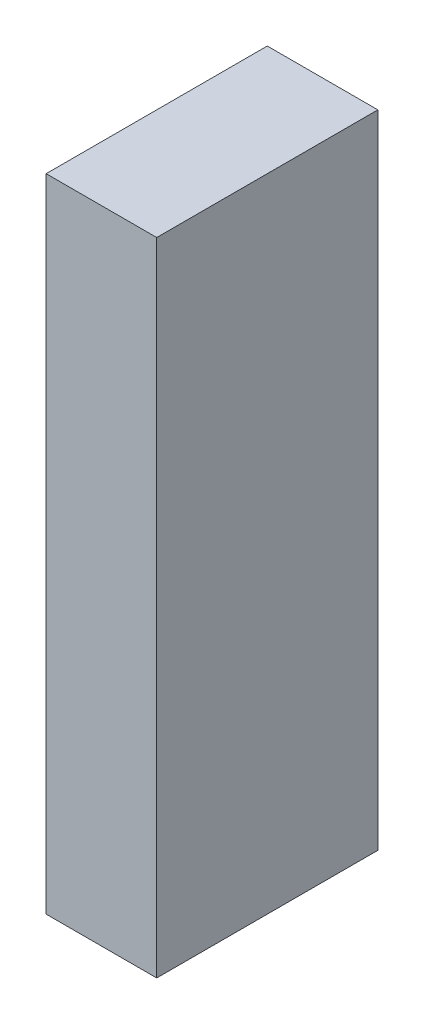
ISO-10303-21;
HEADER;
FILE_DESCRIPTION(('STEP AP214'),'2;1');
FILE_NAME('part.step','',(''),(''),'','','');
FILE_SCHEMA(('AUTOMOTIVE_DESIGN { 1 0 10303 214 1 1 1 1 }'));
ENDSEC;
DATA;
#1=APPLICATION_CONTEXT('core data for automotive mechanical design processes');
#2=APPLICATION_PROTOCOL_DEFINITION('international standard','automotive_design',2000,#1);
#3=PRODUCT_CONTEXT('',#1,'mechanical');
#4=PRODUCT('Part','Part','',(#3));
#5=PRODUCT_RELATED_PRODUCT_CATEGORY('part','',(#4));
#6=PRODUCT_DEFINITION_FORMATION('','',#4);
#7=PRODUCT_DEFINITION_CONTEXT('part definition',#1,'design');
#8=PRODUCT_DEFINITION('design','',#6,#7);
#9=PRODUCT_DEFINITION_SHAPE('','',#8);
#10=(LENGTH_UNIT() NAMED_UNIT(*) SI_UNIT(.MILLI.,.METRE.));
#11=(NAMED_UNIT(*) PLANE_ANGLE_UNIT() SI_UNIT($,.RADIAN.));
#12=(NAMED_UNIT(*) SI_UNIT($,.STERADIAN.) SOLID_ANGLE_UNIT());
#13=UNCERTAINTY_MEASURE_WITH_UNIT(LENGTH_MEASURE(1.E-05),#10,'distance_accuracy_value','');
#14=(GEOMETRIC_REPRESENTATION_CONTEXT(3) GLOBAL_UNCERTAINTY_ASSIGNED_CONTEXT((#13)) GLOBAL_UNIT_ASSIGNED_CONTEXT((#10,
#11,#12)) REPRESENTATION_CONTEXT('',''));
#15=CARTESIAN_POINT('',(0.,0.,0.));
#16=DIRECTION('',(0.,0.,1.));
#17=DIRECTION('',(1.,0.,0.));
#18=AXIS2_PLACEMENT_3D('',#15,#16,#17);
#19=CARTESIAN_POINT('',(12.7000000000001,709.611738,-12.7));
#20=DIRECTION('',(-1.,0.,0.));
#21=DIRECTION('',(0.,-1.,0.));
#22=AXIS2_PLACEMENT_3D('',#19,#20,#21);
#23=PLANE('',#22);
#24=DIRECTION('',(0.,-1.,0.));
#25=VECTOR('',#24,1.);
#26=CARTESIAN_POINT('',(12.7000000000001,709.611738,0.));
#27=LINE('',#26,#25);
#28=CARTESIAN_POINT('',(12.7000000000001,709.611738,0.));
#29=VERTEX_POINT('',#28);
#30=CARTESIAN_POINT('',(12.7000000000001,672.781738,0.));
#31=VERTEX_POINT('',#30);
#32=EDGE_CURVE('E103',#29,#31,#27,.T.);
#33=ORIENTED_EDGE('',*,*,#32,.F.);
#34=DIRECTION('',(0.,0.,1.));
#35=VECTOR('',#34,1.);
#36=CARTESIAN_POINT('',(12.7000000000001,709.611738,-12.7));
#37=LINE('',#36,#35);
#38=CARTESIAN_POINT('',(12.7000000000001,709.611738,-12.7));
#39=VERTEX_POINT('',#38);
#40=EDGE_CURVE('E11',#39,#29,#37,.T.);
#41=ORIENTED_EDGE('',*,*,#40,.F.);
#42=DIRECTION('',(0.,-1.,0.));
#43=VECTOR('',#42,1.);
#44=CARTESIAN_POINT('',(12.7000000000001,709.611738,-12.7));
#45=LINE('',#44,#43);
#46=CARTESIAN_POINT('',(12.7000000000001,672.781738,-12.7));
#47=VERTEX_POINT('',#46);
#48=EDGE_CURVE('E97',#39,#47,#45,.T.);
#49=ORIENTED_EDGE('',*,*,#48,.T.);
#50=DIRECTION('',(0.,0.,1.));
#51=VECTOR('',#50,1.);
#52=CARTESIAN_POINT('',(12.7000000000001,672.781738,-12.7));
#53=LINE('',#52,#51);
#54=EDGE_CURVE('E42',#47,#31,#53,.T.);
#55=ORIENTED_EDGE('',*,*,#54,.T.);
#56=EDGE_LOOP('',(#33,#41,#49,#55));
#57=FACE_BOUND('',#56,.T.);
#58=ADVANCED_FACE('F39',(#57),#23,.T.);
#59=CARTESIAN_POINT('',(12.7000000000001,709.611738,-12.7));
#60=DIRECTION('',(0.,1.,0.));
#61=DIRECTION('',(0.,0.,1.));
#62=AXIS2_PLACEMENT_3D('',#59,#60,#61);
#63=PLANE('',#62);
#64=DIRECTION('',(-1.,0.,0.));
#65=VECTOR('',#64,1.);
#66=CARTESIAN_POINT('',(12.7000000000001,709.611738,0.));
#67=LINE('',#66,#65);
#68=CARTESIAN_POINT('',(19.0500000000001,709.611738,0.));
#69=VERTEX_POINT('',#68);
#70=EDGE_CURVE('E99',#69,#29,#67,.T.);
#71=ORIENTED_EDGE('',*,*,#70,.F.);
#72=DIRECTION('',(0.,0.,1.));
#73=VECTOR('',#72,1.);
#74=CARTESIAN_POINT('',(19.0500000000001,709.611738,-12.7));
#75=LINE('',#74,#73);
#76=CARTESIAN_POINT('',(19.0500000000001,709.611738,-12.7));
#77=VERTEX_POINT('',#76);
#78=EDGE_CURVE('E48',#77,#69,#75,.T.);
#79=ORIENTED_EDGE('',*,*,#78,.F.);
#80=DIRECTION('',(-1.,0.,0.));
#81=VECTOR('',#80,1.);
#82=CARTESIAN_POINT('',(12.7000000000001,709.611738,-12.7));
#83=LINE('',#82,#81);
#84=EDGE_CURVE('E94',#77,#39,#83,.T.);
#85=ORIENTED_EDGE('',*,*,#84,.T.);
#86=ORIENTED_EDGE('',*,*,#40,.T.);
#87=EDGE_LOOP('',(#71,#79,#85,#86));
#88=FACE_BOUND('',#87,.T.);
#89=ADVANCED_FACE('F113',(#88),#63,.T.);
#90=CARTESIAN_POINT('',(19.0500000000001,709.611738,-12.7));
#91=DIRECTION('',(1.,0.,0.));
#92=DIRECTION('',(0.,0.,-1.));
#93=AXIS2_PLACEMENT_3D('',#90,#91,#92);
#94=PLANE('',#93);
#95=DIRECTION('',(0.,1.,0.));
#96=VECTOR('',#95,1.);
#97=CARTESIAN_POINT('',(19.0500000000001,709.611738,0.));
#98=LINE('',#97,#96);
#99=CARTESIAN_POINT('',(19.0500000000001,672.781738,0.));
#100=VERTEX_POINT('',#99);
#101=EDGE_CURVE('E89',#100,#69,#98,.T.);
#102=ORIENTED_EDGE('',*,*,#101,.F.);
#103=DIRECTION('',(0.,0.,1.));
#104=VECTOR('',#103,1.);
#105=CARTESIAN_POINT('',(19.0500000000001,672.781738,-12.7));
#106=LINE('',#105,#104);
#107=CARTESIAN_POINT('',(19.0500000000001,672.781738,-12.7));
#108=VERTEX_POINT('',#107);
#109=EDGE_CURVE('E84',#108,#100,#106,.T.);
#110=ORIENTED_EDGE('',*,*,#109,.F.);
#111=DIRECTION('',(0.,1.,0.));
#112=VECTOR('',#111,1.);
#113=CARTESIAN_POINT('',(19.0500000000001,709.611738,-12.7));
#114=LINE('',#113,#112);
#115=EDGE_CURVE('E87',#108,#77,#114,.T.);
#116=ORIENTED_EDGE('',*,*,#115,.T.);
#117=ORIENTED_EDGE('',*,*,#78,.T.);
#118=EDGE_LOOP('',(#102,#110,#116,#117));
#119=FACE_BOUND('',#118,.T.);
#120=ADVANCED_FACE('F86',(#119),#94,.T.);
#121=CARTESIAN_POINT('',(12.7000000000001,672.781738,-12.7));
#122=DIRECTION('',(0.,-1.,0.));
#123=DIRECTION('',(0.,0.,-1.));
#124=AXIS2_PLACEMENT_3D('',#121,#122,#123);
#125=PLANE('',#124);
#126=DIRECTION('',(1.,0.,0.));
#127=VECTOR('',#126,1.);
#128=CARTESIAN_POINT('',(12.7000000000001,672.781738,0.));
#129=LINE('',#128,#127);
#130=EDGE_CURVE('E106',#31,#100,#129,.T.);
#131=ORIENTED_EDGE('',*,*,#130,.F.);
#132=ORIENTED_EDGE('',*,*,#54,.F.);
#133=DIRECTION('',(1.,0.,0.));
#134=VECTOR('',#133,1.);
#135=CARTESIAN_POINT('',(12.7000000000001,672.781738,-12.7));
#136=LINE('',#135,#134);
#137=EDGE_CURVE('E93',#47,#108,#136,.T.);
#138=ORIENTED_EDGE('',*,*,#137,.T.);
#139=ORIENTED_EDGE('',*,*,#109,.T.);
#140=EDGE_LOOP('',(#131,#132,#138,#139));
#141=FACE_BOUND('',#140,.T.);
#142=ADVANCED_FACE('F96',(#141),#125,.T.);
#143=CARTESIAN_POINT('',(0.,0.,-12.7));
#144=DIRECTION('',(0.,0.,1.));
#145=DIRECTION('',(1.,0.,0.));
#146=AXIS2_PLACEMENT_3D('',#143,#144,#145);
#147=PLANE('',#146);
#148=ORIENTED_EDGE('',*,*,#48,.F.);
#149=ORIENTED_EDGE('',*,*,#84,.F.);
#150=ORIENTED_EDGE('',*,*,#115,.F.);
#151=ORIENTED_EDGE('',*,*,#137,.F.);
#152=EDGE_LOOP('',(#148,#149,#150,#151));
#153=FACE_BOUND('',#152,.T.);
#154=ADVANCED_FACE('F92',(#153),#147,.F.);
#155=CARTESIAN_POINT('',(0.,0.,0.));
#156=DIRECTION('',(0.,0.,1.));
#157=DIRECTION('',(1.,0.,0.));
#158=AXIS2_PLACEMENT_3D('',#155,#156,#157);
#159=PLANE('',#158);
#160=ORIENTED_EDGE('',*,*,#32,.T.);
#161=ORIENTED_EDGE('',*,*,#130,.T.);
#162=ORIENTED_EDGE('',*,*,#101,.T.);
#163=ORIENTED_EDGE('',*,*,#70,.T.);
#164=EDGE_LOOP('',(#160,#161,#162,#163));
#165=FACE_BOUND('',#164,.T.);
#166=ADVANCED_FACE('F112',(#165),#159,.T.);
#167=CLOSED_SHELL('',(#58,#89,#120,#142,#154,#166));
#168=MANIFOLD_SOLID_BREP('B2',#167);
#169=ADVANCED_BREP_SHAPE_REPRESENTATION('',(#18,#168),#14);
#170=SHAPE_DEFINITION_REPRESENTATION(#9,#169);
ENDSEC;
END-ISO-10303-21;
